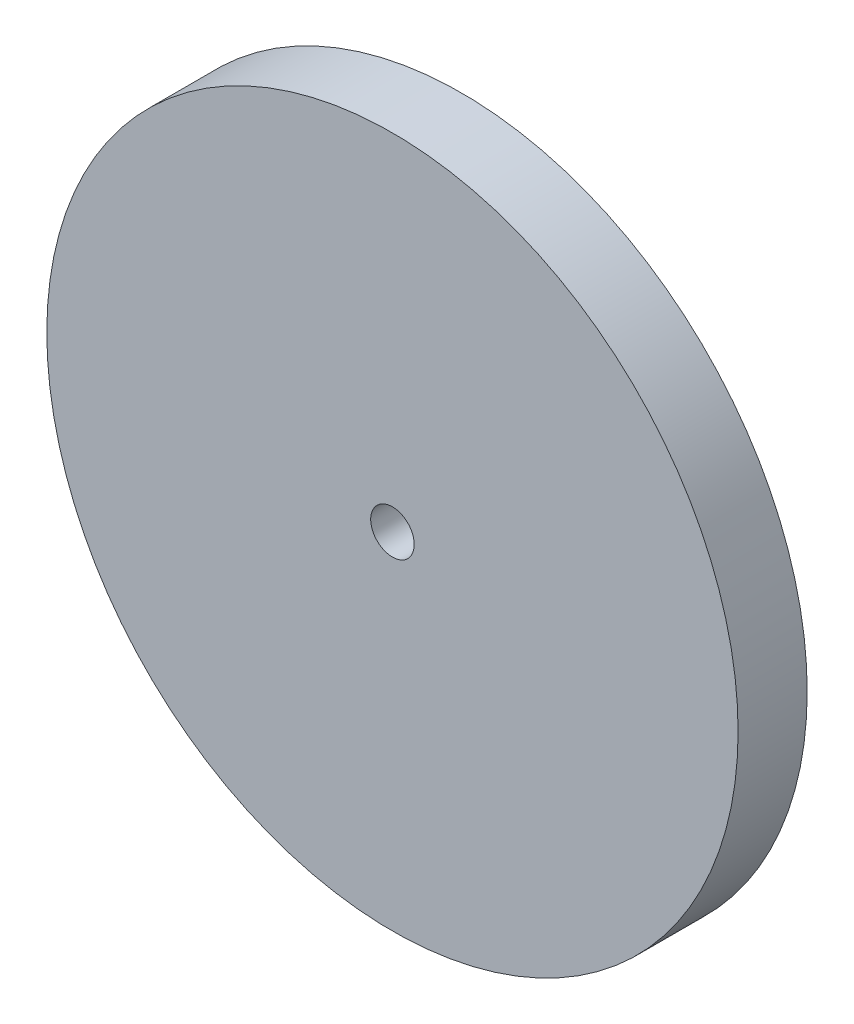
ISO-10303-21;
HEADER;
FILE_DESCRIPTION(('STEP AP214'),'2;1');
FILE_NAME('part.step','',(''),(''),'','','');
FILE_SCHEMA(('AUTOMOTIVE_DESIGN { 1 0 10303 214 1 1 1 1 }'));
ENDSEC;
DATA;
#1=APPLICATION_CONTEXT('core data for automotive mechanical design processes');
#2=APPLICATION_PROTOCOL_DEFINITION('international standard','automotive_design',2000,#1);
#3=PRODUCT_CONTEXT('',#1,'mechanical');
#4=PRODUCT('Part','Part','',(#3));
#5=PRODUCT_RELATED_PRODUCT_CATEGORY('part','',(#4));
#6=PRODUCT_DEFINITION_FORMATION('','',#4);
#7=PRODUCT_DEFINITION_CONTEXT('part definition',#1,'design');
#8=PRODUCT_DEFINITION('design','',#6,#7);
#9=PRODUCT_DEFINITION_SHAPE('','',#8);
#10=(LENGTH_UNIT() NAMED_UNIT(*) SI_UNIT(.MILLI.,.METRE.));
#11=(NAMED_UNIT(*) PLANE_ANGLE_UNIT() SI_UNIT($,.RADIAN.));
#12=(NAMED_UNIT(*) SI_UNIT($,.STERADIAN.) SOLID_ANGLE_UNIT());
#13=UNCERTAINTY_MEASURE_WITH_UNIT(LENGTH_MEASURE(1.E-05),#10,'distance_accuracy_value','');
#14=(GEOMETRIC_REPRESENTATION_CONTEXT(3) GLOBAL_UNCERTAINTY_ASSIGNED_CONTEXT((#13)) GLOBAL_UNIT_ASSIGNED_CONTEXT((#10,
#11,#12)) REPRESENTATION_CONTEXT('',''));
#15=CARTESIAN_POINT('',(0.,0.,0.));
#16=DIRECTION('',(0.,0.,1.));
#17=DIRECTION('',(1.,0.,0.));
#18=AXIS2_PLACEMENT_3D('',#15,#16,#17);
#19=CARTESIAN_POINT('',(0.,0.,4.7625));
#20=DIRECTION('',(0.,0.,-1.));
#21=DIRECTION('',(-1.,0.,0.));
#22=AXIS2_PLACEMENT_3D('',#19,#20,#21);
#23=CYLINDRICAL_SURFACE('',#22,23.8252);
#24=CARTESIAN_POINT('',(0.,0.,4.7625));
#25=DIRECTION('',(0.,0.,1.));
#26=DIRECTION('',(1.,0.,0.));
#27=AXIS2_PLACEMENT_3D('',#24,#25,#26);
#28=CIRCLE('',#27,23.8252);
#29=CARTESIAN_POINT('',(-23.8252,0.,4.7625));
#30=VERTEX_POINT('',#29);
#31=EDGE_CURVE('E10',#30,#30,#28,.T.);
#32=CARTESIAN_POINT('',(0.,0.,0.));
#33=DIRECTION('',(0.,0.,1.));
#34=DIRECTION('',(1.,0.,0.));
#35=AXIS2_PLACEMENT_3D('',#32,#33,#34);
#36=CIRCLE('',#35,23.8252);
#37=CARTESIAN_POINT('',(-23.8252,0.,0.));
#38=VERTEX_POINT('',#37);
#39=EDGE_CURVE('E34',#38,#38,#36,.T.);
#40=CARTESIAN_POINT('',(-23.8252,0.,4.7625));
#41=CARTESIAN_POINT('',(-23.8252,0.,4.712890625));
#42=CARTESIAN_POINT('',(-23.8252,0.,4.66328125));
#43=CARTESIAN_POINT('',(-23.8252,0.,4.5640625));
#44=CARTESIAN_POINT('',(-23.8252,0.,4.514453125));
#45=CARTESIAN_POINT('',(-23.8252,0.,4.415234375));
#46=CARTESIAN_POINT('',(-23.8252,0.,4.365625));
#47=CARTESIAN_POINT('',(-23.8252,0.,4.26640625));
#48=CARTESIAN_POINT('',(-23.8252,0.,4.216796875));
#49=CARTESIAN_POINT('',(-23.8252,0.,4.117578125));
#50=CARTESIAN_POINT('',(-23.8252,0.,4.06796875));
#51=CARTESIAN_POINT('',(-23.8252,0.,3.96875));
#52=CARTESIAN_POINT('',(-23.8252,0.,3.919140625));
#53=CARTESIAN_POINT('',(-23.8252,0.,3.819921875));
#54=CARTESIAN_POINT('',(-23.8252,0.,3.7703125));
#55=CARTESIAN_POINT('',(-23.8252,0.,3.67109375));
#56=CARTESIAN_POINT('',(-23.8252,0.,3.621484375));
#57=CARTESIAN_POINT('',(-23.8252,0.,3.522265625));
#58=CARTESIAN_POINT('',(-23.8252,0.,3.47265625));
#59=CARTESIAN_POINT('',(-23.8252,0.,3.3734375));
#60=CARTESIAN_POINT('',(-23.8252,0.,3.323828125));
#61=CARTESIAN_POINT('',(-23.8252,0.,3.224609375));
#62=CARTESIAN_POINT('',(-23.8252,0.,3.175));
#63=CARTESIAN_POINT('',(-23.8252,0.,3.07578125));
#64=CARTESIAN_POINT('',(-23.8252,0.,3.026171875));
#65=CARTESIAN_POINT('',(-23.8252,0.,2.926953125));
#66=CARTESIAN_POINT('',(-23.8252,0.,2.87734375));
#67=CARTESIAN_POINT('',(-23.8252,0.,2.778125));
#68=CARTESIAN_POINT('',(-23.8252,0.,2.728515625));
#69=CARTESIAN_POINT('',(-23.8252,0.,2.629296875));
#70=CARTESIAN_POINT('',(-23.8252,0.,2.5796875));
#71=CARTESIAN_POINT('',(-23.8252,0.,2.48046875));
#72=CARTESIAN_POINT('',(-23.8252,0.,2.430859375));
#73=CARTESIAN_POINT('',(-23.8252,0.,2.331640625));
#74=CARTESIAN_POINT('',(-23.8252,0.,2.28203125));
#75=CARTESIAN_POINT('',(-23.8252,0.,2.1828125));
#76=CARTESIAN_POINT('',(-23.8252,0.,2.133203125));
#77=CARTESIAN_POINT('',(-23.8252,0.,2.033984375));
#78=CARTESIAN_POINT('',(-23.8252,0.,1.984375));
#79=CARTESIAN_POINT('',(-23.8252,0.,1.88515625));
#80=CARTESIAN_POINT('',(-23.8252,0.,1.835546875));
#81=CARTESIAN_POINT('',(-23.8252,0.,1.736328125));
#82=CARTESIAN_POINT('',(-23.8252,0.,1.68671875));
#83=CARTESIAN_POINT('',(-23.8252,0.,1.5875));
#84=CARTESIAN_POINT('',(-23.8252,0.,1.537890625));
#85=CARTESIAN_POINT('',(-23.8252,0.,1.438671875));
#86=CARTESIAN_POINT('',(-23.8252,0.,1.3890625));
#87=CARTESIAN_POINT('',(-23.8252,0.,1.28984375));
#88=CARTESIAN_POINT('',(-23.8252,0.,1.240234375));
#89=CARTESIAN_POINT('',(-23.8252,0.,1.141015625));
#90=CARTESIAN_POINT('',(-23.8252,0.,1.09140625));
#91=CARTESIAN_POINT('',(-23.8252,0.,0.9921875));
#92=CARTESIAN_POINT('',(-23.8252,0.,0.942578125));
#93=CARTESIAN_POINT('',(-23.8252,0.,0.843359375));
#94=CARTESIAN_POINT('',(-23.8252,0.,0.79375));
#95=CARTESIAN_POINT('',(-23.8252,0.,0.69453125));
#96=CARTESIAN_POINT('',(-23.8252,0.,0.644921875));
#97=CARTESIAN_POINT('',(-23.8252,0.,0.545703125));
#98=CARTESIAN_POINT('',(-23.8252,0.,0.49609375));
#99=CARTESIAN_POINT('',(-23.8252,0.,0.396875));
#100=CARTESIAN_POINT('',(-23.8252,0.,0.347265625));
#101=CARTESIAN_POINT('',(-23.8252,0.,0.248046875));
#102=CARTESIAN_POINT('',(-23.8252,0.,0.1984375));
#103=CARTESIAN_POINT('',(-23.8252,0.,0.09921875));
#104=CARTESIAN_POINT('',(-23.8252,0.,0.049609375));
#105=CARTESIAN_POINT('',(-23.8252,0.,0.));
#106=B_SPLINE_CURVE_WITH_KNOTS('',3,(#40,#41,#42,#43,#44,#45,#46,#47,#48,#49,#50,#51,#52,#53,
#54,#55,#56,#57,#58,#59,#60,#61,#62,#63,#64,#65,#66,#67,#68,#69,#70,#71,#72,#73,#74,#75,#76,#77,
#78,#79,#80,#81,#82,#83,#84,#85,#86,#87,#88,#89,#90,#91,#92,#93,#94,#95,#96,#97,#98,#99,#100,
#101,#102,#103,#104,#105),.UNSPECIFIED.,.F.,.F.,(4,2,2,2,2,2,2,2,2,2,2,2,2,2,2,2,2,2,2,2,2,2,2,
2,2,2,2,2,2,2,2,2,4),(0.,0.148828124999999,0.297656249999999,0.446484374999999,
0.595312499999999,0.744140625,0.89296875,1.041796875,1.190625,1.339453125,1.48828125,
1.637109375,1.7859375,1.934765625,2.08359375,2.232421875,2.38125,2.530078125,2.67890625,
2.827734375,2.9765625,3.125390625,3.27421875,3.423046875,3.571875,3.720703125,3.86953125,
4.018359375,4.1671875,4.316015625,4.46484375,4.613671875,4.7625),.UNSPECIFIED.);
#107=EDGE_CURVE('BSEAM31',#30,#38,#106,.T.);
#108=ORIENTED_EDGE('',*,*,#31,.F.);
#109=ORIENTED_EDGE('',*,*,#39,.T.);
#110=ORIENTED_EDGE('',*,*,#107,.T.);
#111=ORIENTED_EDGE('',*,*,#107,.F.);
#112=EDGE_LOOP('',(#108,#110,#109,#111));
#113=FACE_BOUND('',#112,.T.);
#114=ADVANCED_FACE('F31',(#113),#23,.T.);
#115=CARTESIAN_POINT('',(0.,0.,4.7625));
#116=DIRECTION('',(0.,0.,1.));
#117=DIRECTION('',(1.,0.,0.));
#118=AXIS2_PLACEMENT_3D('',#115,#116,#117);
#119=PLANE('',#118);
#120=CARTESIAN_POINT('',(0.,0.,4.7625));
#121=DIRECTION('',(0.,0.,1.));
#122=DIRECTION('',(1.,0.,0.));
#123=AXIS2_PLACEMENT_3D('',#120,#121,#122);
#124=CIRCLE('',#123,1.5);
#125=CARTESIAN_POINT('',(1.5,0.,4.7625));
#126=VERTEX_POINT('',#125);
#127=EDGE_CURVE('E43',#126,#126,#124,.T.);
#128=ORIENTED_EDGE('',*,*,#127,.F.);
#129=EDGE_LOOP('',(#128));
#130=FACE_BOUND('',#129,.T.);
#131=ORIENTED_EDGE('',*,*,#31,.T.);
#132=EDGE_LOOP('',(#131));
#133=FACE_BOUND('',#132,.T.);
#134=ADVANCED_FACE('F58',(#130,#133),#119,.T.);
#135=CARTESIAN_POINT('',(0.,0.,0.));
#136=DIRECTION('',(0.,0.,1.));
#137=DIRECTION('',(1.,0.,0.));
#138=AXIS2_PLACEMENT_3D('',#135,#136,#137);
#139=PLANE('',#138);
#140=CARTESIAN_POINT('',(0.,0.,0.));
#141=DIRECTION('',(0.,0.,1.));
#142=DIRECTION('',(1.,0.,0.));
#143=AXIS2_PLACEMENT_3D('',#140,#141,#142);
#144=CIRCLE('',#143,1.5);
#145=CARTESIAN_POINT('',(1.5,0.,0.));
#146=VERTEX_POINT('',#145);
#147=EDGE_CURVE('E41',#146,#146,#144,.T.);
#148=ORIENTED_EDGE('',*,*,#147,.T.);
#149=EDGE_LOOP('',(#148));
#150=FACE_BOUND('',#149,.T.);
#151=ORIENTED_EDGE('',*,*,#39,.F.);
#152=EDGE_LOOP('',(#151));
#153=FACE_BOUND('',#152,.T.);
#154=ADVANCED_FACE('F49',(#150,#153),#139,.F.);
#155=CARTESIAN_POINT('',(0.,0.,0.));
#156=DIRECTION('',(0.,0.,1.));
#157=DIRECTION('',(1.,0.,0.));
#158=AXIS2_PLACEMENT_3D('',#155,#156,#157);
#159=CYLINDRICAL_SURFACE('',#158,1.5);
#160=CARTESIAN_POINT('',(1.5,0.,0.));
#161=CARTESIAN_POINT('',(1.5,0.,0.049609375));
#162=CARTESIAN_POINT('',(1.5,0.,0.09921875));
#163=CARTESIAN_POINT('',(1.5,0.,0.1984375));
#164=CARTESIAN_POINT('',(1.5,0.,0.248046875));
#165=CARTESIAN_POINT('',(1.5,0.,0.347265625));
#166=CARTESIAN_POINT('',(1.5,0.,0.396875));
#167=CARTESIAN_POINT('',(1.5,0.,0.49609375));
#168=CARTESIAN_POINT('',(1.5,0.,0.545703125));
#169=CARTESIAN_POINT('',(1.5,0.,0.644921875));
#170=CARTESIAN_POINT('',(1.5,0.,0.69453125));
#171=CARTESIAN_POINT('',(1.5,0.,0.79375));
#172=CARTESIAN_POINT('',(1.5,0.,0.843359375));
#173=CARTESIAN_POINT('',(1.5,0.,0.942578125));
#174=CARTESIAN_POINT('',(1.5,0.,0.9921875));
#175=CARTESIAN_POINT('',(1.5,0.,1.09140625));
#176=CARTESIAN_POINT('',(1.5,0.,1.141015625));
#177=CARTESIAN_POINT('',(1.5,0.,1.240234375));
#178=CARTESIAN_POINT('',(1.5,0.,1.28984375));
#179=CARTESIAN_POINT('',(1.5,0.,1.3890625));
#180=CARTESIAN_POINT('',(1.5,0.,1.438671875));
#181=CARTESIAN_POINT('',(1.5,0.,1.537890625));
#182=CARTESIAN_POINT('',(1.5,0.,1.5875));
#183=CARTESIAN_POINT('',(1.5,0.,1.68671875));
#184=CARTESIAN_POINT('',(1.5,0.,1.736328125));
#185=CARTESIAN_POINT('',(1.5,0.,1.835546875));
#186=CARTESIAN_POINT('',(1.5,0.,1.88515625));
#187=CARTESIAN_POINT('',(1.5,0.,1.984375));
#188=CARTESIAN_POINT('',(1.5,0.,2.033984375));
#189=CARTESIAN_POINT('',(1.5,0.,2.133203125));
#190=CARTESIAN_POINT('',(1.5,0.,2.1828125));
#191=CARTESIAN_POINT('',(1.5,0.,2.28203125));
#192=CARTESIAN_POINT('',(1.5,0.,2.331640625));
#193=CARTESIAN_POINT('',(1.5,0.,2.430859375));
#194=CARTESIAN_POINT('',(1.5,0.,2.48046875));
#195=CARTESIAN_POINT('',(1.5,0.,2.5796875));
#196=CARTESIAN_POINT('',(1.5,0.,2.629296875));
#197=CARTESIAN_POINT('',(1.5,0.,2.728515625));
#198=CARTESIAN_POINT('',(1.5,0.,2.778125));
#199=CARTESIAN_POINT('',(1.5,0.,2.87734375));
#200=CARTESIAN_POINT('',(1.5,0.,2.926953125));
#201=CARTESIAN_POINT('',(1.5,0.,3.026171875));
#202=CARTESIAN_POINT('',(1.5,0.,3.07578125));
#203=CARTESIAN_POINT('',(1.5,0.,3.175));
#204=CARTESIAN_POINT('',(1.5,0.,3.224609375));
#205=CARTESIAN_POINT('',(1.5,0.,3.323828125));
#206=CARTESIAN_POINT('',(1.5,0.,3.3734375));
#207=CARTESIAN_POINT('',(1.5,0.,3.47265625));
#208=CARTESIAN_POINT('',(1.5,0.,3.522265625));
#209=CARTESIAN_POINT('',(1.5,0.,3.621484375));
#210=CARTESIAN_POINT('',(1.5,0.,3.67109375));
#211=CARTESIAN_POINT('',(1.5,0.,3.7703125));
#212=CARTESIAN_POINT('',(1.5,0.,3.819921875));
#213=CARTESIAN_POINT('',(1.5,0.,3.919140625));
#214=CARTESIAN_POINT('',(1.5,0.,3.96875));
#215=CARTESIAN_POINT('',(1.5,0.,4.06796875));
#216=CARTESIAN_POINT('',(1.5,0.,4.117578125));
#217=CARTESIAN_POINT('',(1.5,0.,4.216796875));
#218=CARTESIAN_POINT('',(1.5,0.,4.26640625));
#219=CARTESIAN_POINT('',(1.5,0.,4.365625));
#220=CARTESIAN_POINT('',(1.5,0.,4.415234375));
#221=CARTESIAN_POINT('',(1.5,0.,4.514453125));
#222=CARTESIAN_POINT('',(1.5,0.,4.5640625));
#223=CARTESIAN_POINT('',(1.5,0.,4.66328125));
#224=CARTESIAN_POINT('',(1.5,0.,4.712890625));
#225=CARTESIAN_POINT('',(1.5,0.,4.7625));
#226=B_SPLINE_CURVE_WITH_KNOTS('',3,(#160,#161,#162,#163,#164,#165,#166,#167,#168,#169,#170,
#171,#172,#173,#174,#175,#176,#177,#178,#179,#180,#181,#182,#183,#184,#185,#186,#187,#188,#189,
#190,#191,#192,#193,#194,#195,#196,#197,#198,#199,#200,#201,#202,#203,#204,#205,#206,#207,#208,
#209,#210,#211,#212,#213,#214,#215,#216,#217,#218,#219,#220,#221,#222,#223,#224,#225),
.UNSPECIFIED.,.F.,.F.,(4,2,2,2,2,2,2,2,2,2,2,2,2,2,2,2,2,2,2,2,2,2,2,2,2,2,2,2,2,2,2,2,4),(0.,
0.148828125,0.29765625,0.446484375,0.5953125,0.744140625,0.89296875,1.041796875,1.190625,
1.339453125,1.48828125,1.637109375,1.7859375,1.934765625,2.08359375,2.232421875,2.38125,
2.530078125,2.67890625,2.827734375,2.9765625,3.125390625,3.27421875,3.423046875,3.571875,
3.720703125,3.86953125,4.018359375,4.1671875,4.316015625,4.46484375,4.613671875,4.7625),.UNSPECIFIED.);
#227=EDGE_CURVE('BSEAM52',#146,#126,#226,.T.);
#228=ORIENTED_EDGE('',*,*,#147,.F.);
#229=ORIENTED_EDGE('',*,*,#127,.T.);
#230=ORIENTED_EDGE('',*,*,#227,.T.);
#231=ORIENTED_EDGE('',*,*,#227,.F.);
#232=EDGE_LOOP('',(#228,#230,#229,#231));
#233=FACE_BOUND('',#232,.T.);
#234=ADVANCED_FACE('F52',(#233),#159,.F.);
#235=CLOSED_SHELL('',(#114,#134,#154,#234));
#236=MANIFOLD_SOLID_BREP('B2',#235);
#237=ADVANCED_BREP_SHAPE_REPRESENTATION('',(#18,#236),#14);
#238=SHAPE_DEFINITION_REPRESENTATION(#9,#237);
ENDSEC;
END-ISO-10303-21;
